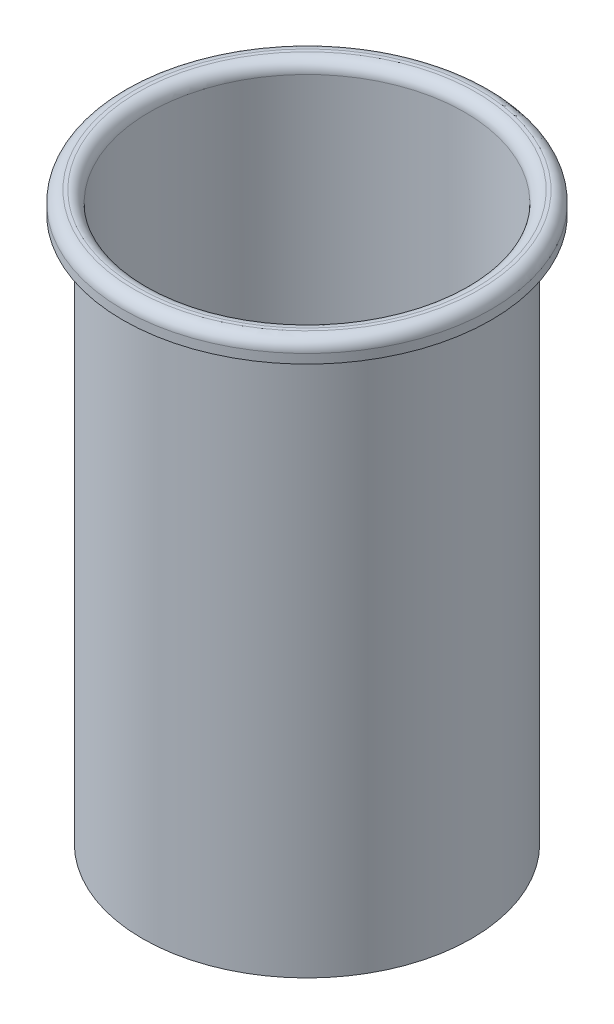
ISO-10303-21;
HEADER;
FILE_DESCRIPTION(('STEP AP214'),'2;1');
FILE_NAME('part.step','',(''),(''),'','','');
FILE_SCHEMA(('AUTOMOTIVE_DESIGN { 1 0 10303 214 1 1 1 1 }'));
ENDSEC;
DATA;
#1=APPLICATION_CONTEXT('core data for automotive mechanical design processes');
#2=APPLICATION_PROTOCOL_DEFINITION('international standard','automotive_design',2000,#1);
#3=PRODUCT_CONTEXT('',#1,'mechanical');
#4=PRODUCT('Part','Part','',(#3));
#5=PRODUCT_RELATED_PRODUCT_CATEGORY('part','',(#4));
#6=PRODUCT_DEFINITION_FORMATION('','',#4);
#7=PRODUCT_DEFINITION_CONTEXT('part definition',#1,'design');
#8=PRODUCT_DEFINITION('design','',#6,#7);
#9=PRODUCT_DEFINITION_SHAPE('','',#8);
#10=(LENGTH_UNIT() NAMED_UNIT(*) SI_UNIT(.MILLI.,.METRE.));
#11=(NAMED_UNIT(*) PLANE_ANGLE_UNIT() SI_UNIT($,.RADIAN.));
#12=(NAMED_UNIT(*) SI_UNIT($,.STERADIAN.) SOLID_ANGLE_UNIT());
#13=UNCERTAINTY_MEASURE_WITH_UNIT(LENGTH_MEASURE(1.E-05),#10,'distance_accuracy_value','');
#14=(GEOMETRIC_REPRESENTATION_CONTEXT(3) GLOBAL_UNCERTAINTY_ASSIGNED_CONTEXT((#13)) GLOBAL_UNIT_ASSIGNED_CONTEXT((#10,
#11,#12)) REPRESENTATION_CONTEXT('',''));
#15=CARTESIAN_POINT('',(0.,0.,0.));
#16=DIRECTION('',(0.,0.,1.));
#17=DIRECTION('',(1.,0.,0.));
#18=AXIS2_PLACEMENT_3D('',#15,#16,#17);
#19=CARTESIAN_POINT('',(0.,6.35,0.));
#20=DIRECTION('',(0.,1.,0.));
#21=DIRECTION('',(0.,0.,1.));
#22=AXIS2_PLACEMENT_3D('',#19,#20,#21);
#23=PLANE('',#22);
#24=CARTESIAN_POINT('',(0.,6.34999999999997,0.));
#25=DIRECTION('',(0.,1.,0.));
#26=DIRECTION('',(0.,0.,1.));
#27=AXIS2_PLACEMENT_3D('',#24,#25,#26);
#28=CIRCLE('',#27,217.4875);
#29=CARTESIAN_POINT('',(0.,6.34999999999997,217.4875));
#30=VERTEX_POINT('',#29);
#31=EDGE_CURVE('P0_E18',#30,#30,#28,.T.);
#32=ORIENTED_EDGE('',*,*,#31,.T.);
#33=EDGE_LOOP('',(#32));
#34=FACE_BOUND('',#33,.T.);
#35=ADVANCED_FACE('P0_F15',(#34),#23,.T.);
#36=CARTESIAN_POINT('',(0.,774.7,0.));
#37=DIRECTION('',(0.,1.,0.));
#38=DIRECTION('',(0.,0.,1.));
#39=AXIS2_PLACEMENT_3D('',#36,#37,#38);
#40=CYLINDRICAL_SURFACE('',#39,217.4875);
#41=ORIENTED_EDGE('',*,*,#31,.F.);
#42=EDGE_LOOP('',(#41));
#43=FACE_BOUND('',#42,.T.);
#44=CARTESIAN_POINT('',(0.,762.,0.));
#45=DIRECTION('',(0.,1.,0.));
#46=DIRECTION('',(-0.0103980013435095,0.,-0.999945939322752));
#47=AXIS2_PLACEMENT_3D('',#44,#45,#46);
#48=CIRCLE('',#47,217.4875);
#49=CARTESIAN_POINT('',(-2.26143531719652,762.,-217.475742478457));
#50=VERTEX_POINT('',#49);
#51=EDGE_CURVE('P0_E86',#50,#50,#48,.F.);
#52=ORIENTED_EDGE('',*,*,#51,.F.);
#53=EDGE_LOOP('',(#52));
#54=FACE_BOUND('',#53,.T.);
#55=ADVANCED_FACE('P0_F91',(#43,#54),#40,.F.);
#56=CARTESIAN_POINT('',(0.,762.,0.));
#57=DIRECTION('',(0.,1.,0.));
#58=DIRECTION('',(-0.0103980013435095,0.,-0.999945939322752));
#59=AXIS2_PLACEMENT_3D('',#56,#57,#58);
#60=TOROIDAL_SURFACE('',#59,233.3625,15.875);
#61=ORIENTED_EDGE('',*,*,#51,.T.);
#62=EDGE_LOOP('',(#61));
#63=FACE_BOUND('',#62,.T.);
#64=CARTESIAN_POINT('',(0.,777.875,0.));
#65=DIRECTION('',(0.,1.,0.));
#66=DIRECTION('',(0.,0.,1.));
#67=AXIS2_PLACEMENT_3D('',#64,#65,#66);
#68=CIRCLE('',#67,233.3625);
#69=CARTESIAN_POINT('',(0.,777.875,233.3625));
#70=VERTEX_POINT('',#69);
#71=EDGE_CURVE('P0_E49',#70,#70,#68,.F.);
#72=ORIENTED_EDGE('',*,*,#71,.F.);
#73=EDGE_LOOP('',(#72));
#74=FACE_BOUND('',#73,.T.);
#75=ADVANCED_FACE('P0_F88',(#63,#74),#60,.T.);
#76=CARTESIAN_POINT('',(0.,777.875,0.));
#77=DIRECTION('',(0.,1.,0.));
#78=DIRECTION('',(0.,0.,1.));
#79=AXIS2_PLACEMENT_3D('',#76,#77,#78);
#80=PLANE('',#79);
#81=ORIENTED_EDGE('',*,*,#71,.T.);
#82=EDGE_LOOP('',(#81));
#83=FACE_BOUND('',#82,.T.);
#84=CARTESIAN_POINT('',(0.,777.875,0.));
#85=DIRECTION('',(0.,-1.,0.));
#86=DIRECTION('',(-1.,0.,0.));
#87=AXIS2_PLACEMENT_3D('',#84,#85,#86);
#88=CIRCLE('',#87,238.125);
#89=CARTESIAN_POINT('',(-238.125,777.875,-3.20707002621212E-13));
#90=VERTEX_POINT('',#89);
#91=EDGE_CURVE('P0_E44',#90,#90,#88,.T.);
#92=ORIENTED_EDGE('',*,*,#91,.F.);
#93=EDGE_LOOP('',(#92));
#94=FACE_BOUND('',#93,.T.);
#95=ADVANCED_FACE('P0_F69',(#83,#94),#80,.T.);
#96=CARTESIAN_POINT('',(0.,762.,0.));
#97=DIRECTION('',(0.,1.,0.));
#98=DIRECTION('',(0.999979266012991,0.,0.00643952980572295));
#99=AXIS2_PLACEMENT_3D('',#96,#97,#98);
#100=TOROIDAL_SURFACE('',#99,238.125,15.875);
#101=CARTESIAN_POINT('',(0.,762.,0.));
#102=DIRECTION('',(0.,1.,0.));
#103=DIRECTION('',(0.,0.,1.));
#104=AXIS2_PLACEMENT_3D('',#101,#102,#103);
#105=CIRCLE('',#104,254.);
#106=CARTESIAN_POINT('',(0.,762.,254.));
#107=VERTEX_POINT('',#106);
#108=EDGE_CURVE('P0_E40',#107,#107,#105,.F.);
#109=ORIENTED_EDGE('',*,*,#108,.F.);
#110=EDGE_LOOP('',(#109));
#111=FACE_BOUND('',#110,.T.);
#112=ORIENTED_EDGE('',*,*,#91,.T.);
#113=EDGE_LOOP('',(#112));
#114=FACE_BOUND('',#113,.T.);
#115=ADVANCED_FACE('P0_F63',(#111,#114),#100,.T.);
#116=CARTESIAN_POINT('',(0.,774.7,0.));
#117=DIRECTION('',(0.,1.,0.));
#118=DIRECTION('',(0.,0.,1.));
#119=AXIS2_PLACEMENT_3D('',#116,#117,#118);
#120=CYLINDRICAL_SURFACE('',#119,254.);
#121=CARTESIAN_POINT('',(0.,749.3,0.));
#122=DIRECTION('',(0.,1.,0.));
#123=DIRECTION('',(0.,0.,1.));
#124=AXIS2_PLACEMENT_3D('',#121,#122,#123);
#125=CIRCLE('',#124,254.);
#126=CARTESIAN_POINT('',(0.,749.3,254.));
#127=VERTEX_POINT('',#126);
#128=EDGE_CURVE('P0_E38',#127,#127,#125,.T.);
#129=ORIENTED_EDGE('',*,*,#128,.T.);
#130=EDGE_LOOP('',(#129));
#131=FACE_BOUND('',#130,.T.);
#132=ORIENTED_EDGE('',*,*,#108,.T.);
#133=EDGE_LOOP('',(#132));
#134=FACE_BOUND('',#133,.T.);
#135=ADVANCED_FACE('P0_F68',(#131,#134),#120,.T.);
#136=CARTESIAN_POINT('',(0.,749.3,0.));
#137=DIRECTION('',(0.,1.,0.));
#138=DIRECTION('',(0.,0.,1.));
#139=AXIS2_PLACEMENT_3D('',#136,#137,#138);
#140=PLANE('',#139);
#141=CARTESIAN_POINT('',(0.,749.3,0.));
#142=DIRECTION('',(0.,1.,0.));
#143=DIRECTION('',(0.,0.,1.));
#144=AXIS2_PLACEMENT_3D('',#141,#142,#143);
#145=CIRCLE('',#144,250.825);
#146=CARTESIAN_POINT('',(0.,749.3,250.825));
#147=VERTEX_POINT('',#146);
#148=EDGE_CURVE('P0_E35',#147,#147,#145,.T.);
#149=ORIENTED_EDGE('',*,*,#148,.T.);
#150=EDGE_LOOP('',(#149));
#151=FACE_BOUND('',#150,.T.);
#152=ORIENTED_EDGE('',*,*,#128,.F.);
#153=EDGE_LOOP('',(#152));
#154=FACE_BOUND('',#153,.T.);
#155=ADVANCED_FACE('P0_F170',(#151,#154),#140,.F.);
#156=CARTESIAN_POINT('',(0.,774.7,0.));
#157=DIRECTION('',(0.,1.,0.));
#158=DIRECTION('',(0.,0.,1.));
#159=AXIS2_PLACEMENT_3D('',#156,#157,#158);
#160=CYLINDRICAL_SURFACE('',#159,250.825);
#161=CARTESIAN_POINT('',(0.,762.,0.));
#162=DIRECTION('',(0.,1.,0.));
#163=DIRECTION('',(0.999979266012992,0.,0.00643952980572294));
#164=AXIS2_PLACEMENT_3D('',#161,#162,#163);
#165=CIRCLE('',#164,250.825);
#166=CARTESIAN_POINT('',(250.819799397709,762.,1.61519506352046));
#167=VERTEX_POINT('',#166);
#168=EDGE_CURVE('P0_E37',#167,#167,#165,.T.);
#169=ORIENTED_EDGE('',*,*,#168,.T.);
#170=EDGE_LOOP('',(#169));
#171=FACE_BOUND('',#170,.T.);
#172=ORIENTED_EDGE('',*,*,#148,.F.);
#173=EDGE_LOOP('',(#172));
#174=FACE_BOUND('',#173,.T.);
#175=ADVANCED_FACE('P0_F167',(#171,#174),#160,.F.);
#176=CARTESIAN_POINT('',(0.,762.,0.));
#177=DIRECTION('',(0.,1.,0.));
#178=DIRECTION('',(0.999979266012991,0.,0.00643952980572294));
#179=AXIS2_PLACEMENT_3D('',#176,#177,#178);
#180=TOROIDAL_SURFACE('',#179,238.125,12.7);
#181=ORIENTED_EDGE('',*,*,#168,.F.);
#182=EDGE_LOOP('',(#181));
#183=FACE_BOUND('',#182,.T.);
#184=CARTESIAN_POINT('',(0.,774.7,0.));
#185=DIRECTION('',(0.,1.,0.));
#186=DIRECTION('',(1.,0.,0.));
#187=AXIS2_PLACEMENT_3D('',#184,#185,#186);
#188=CIRCLE('',#187,238.125);
#189=CARTESIAN_POINT('',(238.125,774.7,0.));
#190=VERTEX_POINT('',#189);
#191=EDGE_CURVE('P0_E130',#190,#190,#188,.T.);
#192=ORIENTED_EDGE('',*,*,#191,.T.);
#193=EDGE_LOOP('',(#192));
#194=FACE_BOUND('',#193,.T.);
#195=ADVANCED_FACE('P0_F163',(#183,#194),#180,.F.);
#196=CARTESIAN_POINT('',(0.,774.7,0.));
#197=DIRECTION('',(0.,1.,0.));
#198=DIRECTION('',(0.,0.,1.));
#199=AXIS2_PLACEMENT_3D('',#196,#197,#198);
#200=PLANE('',#199);
#201=CARTESIAN_POINT('',(0.,774.7,0.));
#202=DIRECTION('',(0.,-1.,0.));
#203=DIRECTION('',(0.,0.,-1.));
#204=AXIS2_PLACEMENT_3D('',#201,#202,#203);
#205=CIRCLE('',#204,233.3625);
#206=CARTESIAN_POINT('',(2.53703308361608E-13,774.7,-233.3625));
#207=VERTEX_POINT('',#206);
#208=EDGE_CURVE('P0_E27',#207,#207,#205,.F.);
#209=ORIENTED_EDGE('',*,*,#208,.T.);
#210=EDGE_LOOP('',(#209));
#211=FACE_BOUND('',#210,.T.);
#212=ORIENTED_EDGE('',*,*,#191,.F.);
#213=EDGE_LOOP('',(#212));
#214=FACE_BOUND('',#213,.T.);
#215=ADVANCED_FACE('P0_F118',(#211,#214),#200,.F.);
#216=CARTESIAN_POINT('',(0.,762.,0.));
#217=DIRECTION('',(0.,1.,0.));
#218=DIRECTION('',(-0.0103980013435095,0.,-0.999945939322752));
#219=AXIS2_PLACEMENT_3D('',#216,#217,#218);
#220=TOROIDAL_SURFACE('',#219,233.3625,12.7);
#221=CARTESIAN_POINT('',(0.,762.,0.));
#222=DIRECTION('',(0.,1.,0.));
#223=DIRECTION('',(0.,0.,1.));
#224=AXIS2_PLACEMENT_3D('',#221,#222,#223);
#225=CIRCLE('',#224,220.6625);
#226=CARTESIAN_POINT('',(0.,762.,220.6625));
#227=VERTEX_POINT('',#226);
#228=EDGE_CURVE('P0_E22',#227,#227,#225,.F.);
#229=ORIENTED_EDGE('',*,*,#228,.F.);
#230=EDGE_LOOP('',(#229));
#231=FACE_BOUND('',#230,.T.);
#232=ORIENTED_EDGE('',*,*,#208,.F.);
#233=EDGE_LOOP('',(#232));
#234=FACE_BOUND('',#233,.T.);
#235=ADVANCED_FACE('P0_F109',(#231,#234),#220,.F.);
#236=CARTESIAN_POINT('',(0.,3.175,0.));
#237=DIRECTION('',(0.,1.,0.));
#238=DIRECTION('',(0.,0.,1.));
#239=AXIS2_PLACEMENT_3D('',#236,#237,#238);
#240=PLANE('',#239);
#241=CARTESIAN_POINT('',(0.,3.17500000000004,0.));
#242=DIRECTION('',(0.,1.,0.));
#243=DIRECTION('',(0.,0.,1.));
#244=AXIS2_PLACEMENT_3D('',#241,#242,#243);
#245=CIRCLE('',#244,220.6625);
#246=CARTESIAN_POINT('',(0.,3.17500000000004,220.6625));
#247=VERTEX_POINT('',#246);
#248=EDGE_CURVE('P0_E10',#247,#247,#245,.T.);
#249=ORIENTED_EDGE('',*,*,#248,.F.);
#250=EDGE_LOOP('',(#249));
#251=FACE_BOUND('',#250,.T.);
#252=ADVANCED_FACE('P0_F104',(#251),#240,.F.);
#253=CARTESIAN_POINT('',(0.,774.7,0.));
#254=DIRECTION('',(0.,1.,0.));
#255=DIRECTION('',(0.,0.,1.));
#256=AXIS2_PLACEMENT_3D('',#253,#254,#255);
#257=CYLINDRICAL_SURFACE('',#256,220.6625);
#258=ORIENTED_EDGE('',*,*,#248,.T.);
#259=EDGE_LOOP('',(#258));
#260=FACE_BOUND('',#259,.T.);
#261=ORIENTED_EDGE('',*,*,#228,.T.);
#262=EDGE_LOOP('',(#261));
#263=FACE_BOUND('',#262,.T.);
#264=ADVANCED_FACE('P0_F102',(#260,#263),#257,.T.);
#265=CLOSED_SHELL('',(#35,#55,#75,#95,#115,#135,#155,#175,#195,#215,#235,#252,#264));
#266=MANIFOLD_SOLID_BREP('P0_B1',#265);
#267=CARTESIAN_POINT('',(0.,0.,0.));
#268=DIRECTION('',(0.,1.,0.));
#269=DIRECTION('',(0.,0.,1.));
#270=AXIS2_PLACEMENT_3D('',#267,#268,#269);
#271=PLANE('',#270);
#272=CARTESIAN_POINT('',(0.,0.,0.));
#273=DIRECTION('',(0.,1.,0.));
#274=DIRECTION('',(0.,0.,1.));
#275=AXIS2_PLACEMENT_3D('',#272,#273,#274);
#276=CIRCLE('',#275,223.8375);
#277=CARTESIAN_POINT('',(0.,0.,223.8375));
#278=VERTEX_POINT('',#277);
#279=EDGE_CURVE('P1_E18',#278,#278,#276,.T.);
#280=ORIENTED_EDGE('',*,*,#279,.T.);
#281=EDGE_LOOP('',(#280));
#282=FACE_BOUND('',#281,.T.);
#283=ADVANCED_FACE('P1_F15',(#282),#271,.T.);
#284=CARTESIAN_POINT('',(0.,0.,0.));
#285=DIRECTION('',(0.,1.,0.));
#286=DIRECTION('',(0.,0.,1.));
#287=AXIS2_PLACEMENT_3D('',#284,#285,#286);
#288=CYLINDRICAL_SURFACE('',#287,223.8375);
#289=ORIENTED_EDGE('',*,*,#279,.F.);
#290=EDGE_LOOP('',(#289));
#291=FACE_BOUND('',#290,.T.);
#292=CARTESIAN_POINT('',(0.,749.3,0.));
#293=DIRECTION('',(0.,1.,0.));
#294=DIRECTION('',(0.,0.,1.));
#295=AXIS2_PLACEMENT_3D('',#292,#293,#294);
#296=CIRCLE('',#295,223.8375);
#297=CARTESIAN_POINT('',(0.,749.3,223.8375));
#298=VERTEX_POINT('',#297);
#299=EDGE_CURVE('P1_E27',#298,#298,#296,.F.);
#300=ORIENTED_EDGE('',*,*,#299,.F.);
#301=EDGE_LOOP('',(#300));
#302=FACE_BOUND('',#301,.T.);
#303=ADVANCED_FACE('P1_F36',(#291,#302),#288,.F.);
#304=CARTESIAN_POINT('',(0.,749.3,0.));
#305=DIRECTION('',(0.,1.,0.));
#306=DIRECTION('',(0.,0.,1.));
#307=AXIS2_PLACEMENT_3D('',#304,#305,#306);
#308=PLANE('',#307);
#309=ORIENTED_EDGE('',*,*,#299,.T.);
#310=EDGE_LOOP('',(#309));
#311=FACE_BOUND('',#310,.T.);
#312=CARTESIAN_POINT('',(0.,749.3,0.));
#313=DIRECTION('',(0.,1.,0.));
#314=DIRECTION('',(0.,0.,1.));
#315=AXIS2_PLACEMENT_3D('',#312,#313,#314);
#316=CIRCLE('',#315,227.0125);
#317=CARTESIAN_POINT('',(0.,749.3,227.0125));
#318=VERTEX_POINT('',#317);
#319=EDGE_CURVE('P1_E22',#318,#318,#316,.F.);
#320=ORIENTED_EDGE('',*,*,#319,.F.);
#321=EDGE_LOOP('',(#320));
#322=FACE_BOUND('',#321,.T.);
#323=ADVANCED_FACE('P1_F39',(#311,#322),#308,.T.);
#324=CARTESIAN_POINT('',(0.,-3.175,0.));
#325=DIRECTION('',(0.,1.,0.));
#326=DIRECTION('',(0.,0.,1.));
#327=AXIS2_PLACEMENT_3D('',#324,#325,#326);
#328=PLANE('',#327);
#329=CARTESIAN_POINT('',(0.,-3.175,0.));
#330=DIRECTION('',(0.,1.,0.));
#331=DIRECTION('',(0.,0.,1.));
#332=AXIS2_PLACEMENT_3D('',#329,#330,#331);
#333=CIRCLE('',#332,227.0125);
#334=CARTESIAN_POINT('',(0.,-3.175,227.0125));
#335=VERTEX_POINT('',#334);
#336=EDGE_CURVE('P1_E10',#335,#335,#333,.T.);
#337=ORIENTED_EDGE('',*,*,#336,.F.);
#338=EDGE_LOOP('',(#337));
#339=FACE_BOUND('',#338,.T.);
#340=ADVANCED_FACE('P1_F45',(#339),#328,.F.);
#341=CARTESIAN_POINT('',(0.,0.,0.));
#342=DIRECTION('',(0.,1.,0.));
#343=DIRECTION('',(0.,0.,1.));
#344=AXIS2_PLACEMENT_3D('',#341,#342,#343);
#345=CYLINDRICAL_SURFACE('',#344,227.0125);
#346=ORIENTED_EDGE('',*,*,#336,.T.);
#347=EDGE_LOOP('',(#346));
#348=FACE_BOUND('',#347,.T.);
#349=ORIENTED_EDGE('',*,*,#319,.T.);
#350=EDGE_LOOP('',(#349));
#351=FACE_BOUND('',#350,.T.);
#352=ADVANCED_FACE('P1_F47',(#348,#351),#345,.T.);
#353=CLOSED_SHELL('',(#283,#303,#323,#340,#352));
#354=MANIFOLD_SOLID_BREP('P1_B1',#353);
#355=ADVANCED_BREP_SHAPE_REPRESENTATION('',(#18,#266,#354),#14);
#356=SHAPE_DEFINITION_REPRESENTATION(#9,#355);
ENDSEC;
END-ISO-10303-21;
